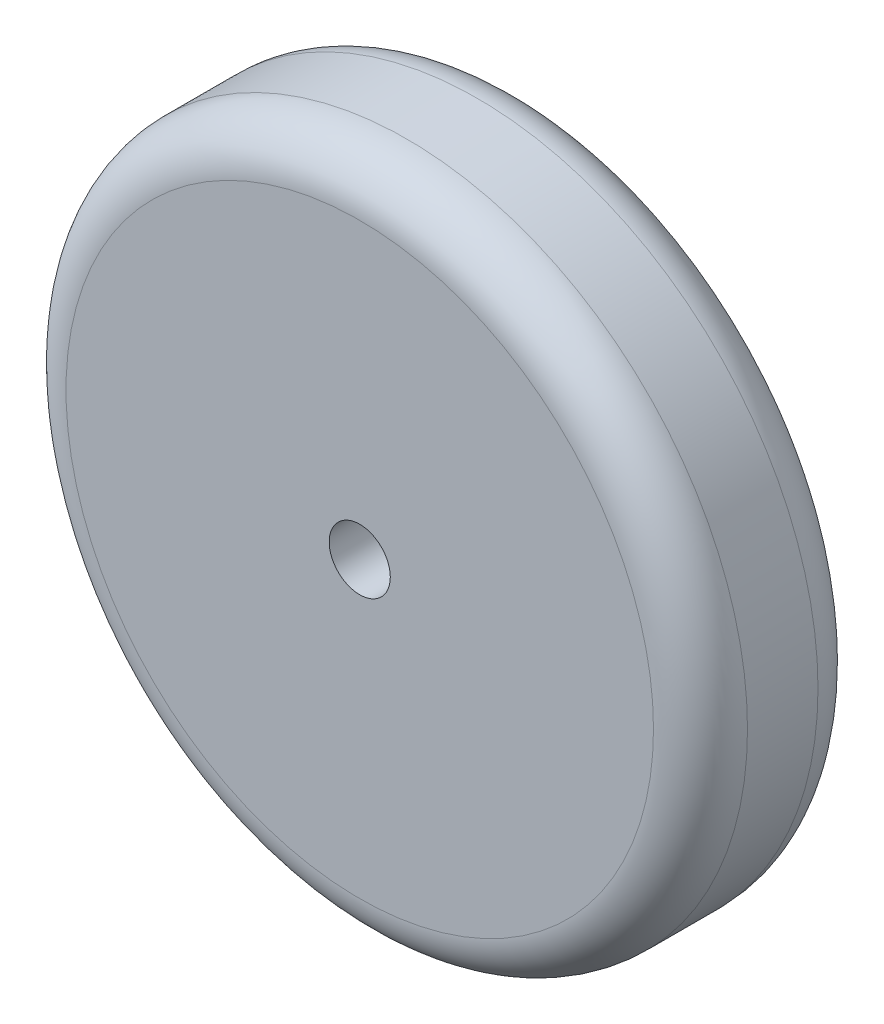
ISO-10303-21;
HEADER;
FILE_DESCRIPTION(('STEP AP214'),'2;1');
FILE_NAME('part.step','',(''),(''),'','','');
FILE_SCHEMA(('AUTOMOTIVE_DESIGN { 1 0 10303 214 1 1 1 1 }'));
ENDSEC;
DATA;
#1=APPLICATION_CONTEXT('core data for automotive mechanical design processes');
#2=APPLICATION_PROTOCOL_DEFINITION('international standard','automotive_design',2000,#1);
#3=PRODUCT_CONTEXT('',#1,'mechanical');
#4=PRODUCT('Part','Part','',(#3));
#5=PRODUCT_RELATED_PRODUCT_CATEGORY('part','',(#4));
#6=PRODUCT_DEFINITION_FORMATION('','',#4);
#7=PRODUCT_DEFINITION_CONTEXT('part definition',#1,'design');
#8=PRODUCT_DEFINITION('design','',#6,#7);
#9=PRODUCT_DEFINITION_SHAPE('','',#8);
#10=(LENGTH_UNIT() NAMED_UNIT(*) SI_UNIT(.MILLI.,.METRE.));
#11=(NAMED_UNIT(*) PLANE_ANGLE_UNIT() SI_UNIT($,.RADIAN.));
#12=(NAMED_UNIT(*) SI_UNIT($,.STERADIAN.) SOLID_ANGLE_UNIT());
#13=UNCERTAINTY_MEASURE_WITH_UNIT(LENGTH_MEASURE(1.E-05),#10,'distance_accuracy_value','');
#14=(GEOMETRIC_REPRESENTATION_CONTEXT(3) GLOBAL_UNCERTAINTY_ASSIGNED_CONTEXT((#13)) GLOBAL_UNIT_ASSIGNED_CONTEXT((#10,
#11,#12)) REPRESENTATION_CONTEXT('',''));
#15=CARTESIAN_POINT('',(0.,0.,0.));
#16=DIRECTION('',(0.,0.,1.));
#17=DIRECTION('',(1.,0.,0.));
#18=AXIS2_PLACEMENT_3D('',#15,#16,#17);
#19=CARTESIAN_POINT('',(0.,0.,35.));
#20=DIRECTION('',(0.,0.,1.));
#21=DIRECTION('',(1.,0.,0.));
#22=AXIS2_PLACEMENT_3D('',#19,#20,#21);
#23=PLANE('',#22);
#24=CARTESIAN_POINT('',(0.,0.,35.));
#25=DIRECTION('',(0.,0.,1.));
#26=DIRECTION('',(1.,0.,0.));
#27=AXIS2_PLACEMENT_3D('',#24,#25,#26);
#28=CIRCLE('',#27,62.5);
#29=CARTESIAN_POINT('',(62.5,0.,35.));
#30=VERTEX_POINT('',#29);
#31=EDGE_CURVE('E39',#30,#30,#28,.T.);
#32=ORIENTED_EDGE('',*,*,#31,.T.);
#33=EDGE_LOOP('',(#32));
#34=FACE_BOUND('',#33,.T.);
#35=CARTESIAN_POINT('',(0.,0.,35.));
#36=DIRECTION('',(0.,0.,1.));
#37=DIRECTION('',(1.,0.,0.));
#38=AXIS2_PLACEMENT_3D('',#35,#36,#37);
#39=CIRCLE('',#38,6.5);
#40=CARTESIAN_POINT('',(6.5,0.,35.));
#41=VERTEX_POINT('',#40);
#42=EDGE_CURVE('E52',#41,#41,#39,.T.);
#43=ORIENTED_EDGE('',*,*,#42,.F.);
#44=EDGE_LOOP('',(#43));
#45=FACE_BOUND('',#44,.T.);
#46=ADVANCED_FACE('F32',(#34,#45),#23,.T.);
#47=CARTESIAN_POINT('',(0.,0.,0.));
#48=DIRECTION('',(0.,0.,1.));
#49=DIRECTION('',(1.,0.,0.));
#50=AXIS2_PLACEMENT_3D('',#47,#48,#49);
#51=PLANE('',#50);
#52=CARTESIAN_POINT('',(0.,0.,0.));
#53=DIRECTION('',(0.,0.,1.));
#54=DIRECTION('',(1.,0.,0.));
#55=AXIS2_PLACEMENT_3D('',#52,#53,#54);
#56=CIRCLE('',#55,62.5);
#57=CARTESIAN_POINT('',(62.5,0.,0.));
#58=VERTEX_POINT('',#57);
#59=EDGE_CURVE('E43',#58,#58,#56,.F.);
#60=ORIENTED_EDGE('',*,*,#59,.T.);
#61=EDGE_LOOP('',(#60));
#62=FACE_BOUND('',#61,.T.);
#63=CARTESIAN_POINT('',(0.,0.,0.));
#64=DIRECTION('',(0.,0.,1.));
#65=DIRECTION('',(1.,0.,0.));
#66=AXIS2_PLACEMENT_3D('',#63,#64,#65);
#67=CIRCLE('',#66,6.5);
#68=CARTESIAN_POINT('',(6.5,0.,0.));
#69=VERTEX_POINT('',#68);
#70=EDGE_CURVE('E53',#69,#69,#67,.T.);
#71=ORIENTED_EDGE('',*,*,#70,.T.);
#72=EDGE_LOOP('',(#71));
#73=FACE_BOUND('',#72,.T.);
#74=ADVANCED_FACE('F63',(#62,#73),#51,.F.);
#75=CARTESIAN_POINT('',(0.,0.,35.));
#76=DIRECTION('',(0.,0.,-1.));
#77=DIRECTION('',(-1.,0.,0.));
#78=AXIS2_PLACEMENT_3D('',#75,#76,#77);
#79=CYLINDRICAL_SURFACE('',#78,72.5);
#80=CARTESIAN_POINT('',(0.,0.,25.));
#81=DIRECTION('',(0.,0.,1.));
#82=DIRECTION('',(1.,0.,0.));
#83=AXIS2_PLACEMENT_3D('',#80,#81,#82);
#84=CIRCLE('',#83,72.5);
#85=CARTESIAN_POINT('',(72.5,0.,25.));
#86=VERTEX_POINT('',#85);
#87=EDGE_CURVE('E10',#86,#86,#84,.F.);
#88=ORIENTED_EDGE('',*,*,#87,.T.);
#89=EDGE_LOOP('',(#88));
#90=FACE_BOUND('',#89,.T.);
#91=CARTESIAN_POINT('',(0.,0.,10.));
#92=DIRECTION('',(0.,0.,1.));
#93=DIRECTION('',(1.,0.,0.));
#94=AXIS2_PLACEMENT_3D('',#91,#92,#93);
#95=CIRCLE('',#94,72.5);
#96=CARTESIAN_POINT('',(72.5,0.,10.));
#97=VERTEX_POINT('',#96);
#98=EDGE_CURVE('E47',#97,#97,#95,.T.);
#99=ORIENTED_EDGE('',*,*,#98,.T.);
#100=EDGE_LOOP('',(#99));
#101=FACE_BOUND('',#100,.T.);
#102=ADVANCED_FACE('F68',(#90,#101),#79,.T.);
#103=CARTESIAN_POINT('',(0.,0.,35.));
#104=DIRECTION('',(0.,0.,-1.));
#105=DIRECTION('',(-1.,0.,0.));
#106=AXIS2_PLACEMENT_3D('',#103,#104,#105);
#107=CYLINDRICAL_SURFACE('',#106,6.5);
#108=ORIENTED_EDGE('',*,*,#42,.T.);
#109=EDGE_LOOP('',(#108));
#110=FACE_BOUND('',#109,.T.);
#111=ORIENTED_EDGE('',*,*,#70,.F.);
#112=EDGE_LOOP('',(#111));
#113=FACE_BOUND('',#112,.T.);
#114=ADVANCED_FACE('F59',(#110,#113),#107,.F.);
#115=CARTESIAN_POINT('',(0.,0.,10.));
#116=DIRECTION('',(0.,0.,1.));
#117=DIRECTION('',(1.,0.,0.));
#118=AXIS2_PLACEMENT_3D('',#115,#116,#117);
#119=TOROIDAL_SURFACE('',#118,62.5,10.);
#120=ORIENTED_EDGE('',*,*,#59,.F.);
#121=EDGE_LOOP('',(#120));
#122=FACE_BOUND('',#121,.T.);
#123=ORIENTED_EDGE('',*,*,#98,.F.);
#124=EDGE_LOOP('',(#123));
#125=FACE_BOUND('',#124,.T.);
#126=ADVANCED_FACE('F74',(#122,#125),#119,.T.);
#127=CARTESIAN_POINT('',(0.,0.,25.));
#128=DIRECTION('',(0.,0.,1.));
#129=DIRECTION('',(1.,0.,0.));
#130=AXIS2_PLACEMENT_3D('',#127,#128,#129);
#131=TOROIDAL_SURFACE('',#130,62.5,10.);
#132=ORIENTED_EDGE('',*,*,#87,.F.);
#133=EDGE_LOOP('',(#132));
#134=FACE_BOUND('',#133,.T.);
#135=ORIENTED_EDGE('',*,*,#31,.F.);
#136=EDGE_LOOP('',(#135));
#137=FACE_BOUND('',#136,.T.);
#138=ADVANCED_FACE('F34',(#134,#137),#131,.T.);
#139=CLOSED_SHELL('',(#46,#74,#102,#114,#126,#138));
#140=MANIFOLD_SOLID_BREP('B2',#139);
#141=ADVANCED_BREP_SHAPE_REPRESENTATION('',(#18,#140),#14);
#142=SHAPE_DEFINITION_REPRESENTATION(#9,#141);
ENDSEC;
END-ISO-10303-21;
